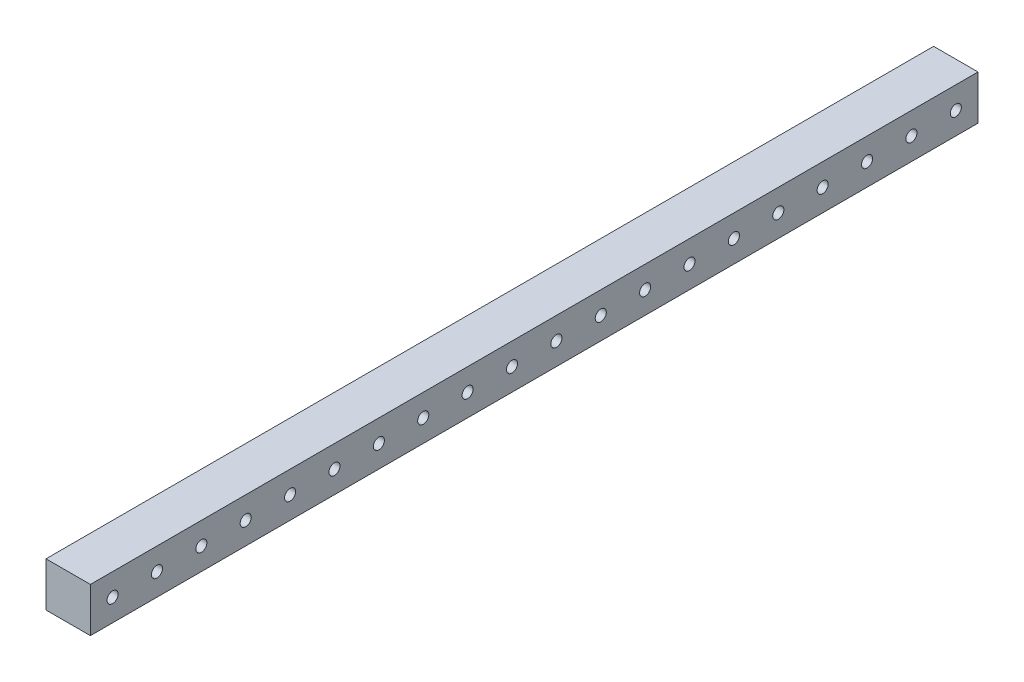
ISO-10303-21;
HEADER;
FILE_DESCRIPTION(('STEP AP214'),'2;1');
FILE_NAME('part.step','',(''),(''),'','','');
FILE_SCHEMA(('AUTOMOTIVE_DESIGN { 1 0 10303 214 1 1 1 1 }'));
ENDSEC;
DATA;
#1=APPLICATION_CONTEXT('core data for automotive mechanical design processes');
#2=APPLICATION_PROTOCOL_DEFINITION('international standard','automotive_design',2000,#1);
#3=PRODUCT_CONTEXT('',#1,'mechanical');
#4=PRODUCT('Part','Part','',(#3));
#5=PRODUCT_RELATED_PRODUCT_CATEGORY('part','',(#4));
#6=PRODUCT_DEFINITION_FORMATION('','',#4);
#7=PRODUCT_DEFINITION_CONTEXT('part definition',#1,'design');
#8=PRODUCT_DEFINITION('design','',#6,#7);
#9=PRODUCT_DEFINITION_SHAPE('','',#8);
#10=(LENGTH_UNIT() NAMED_UNIT(*) SI_UNIT(.MILLI.,.METRE.));
#11=(NAMED_UNIT(*) PLANE_ANGLE_UNIT() SI_UNIT($,.RADIAN.));
#12=(NAMED_UNIT(*) SI_UNIT($,.STERADIAN.) SOLID_ANGLE_UNIT());
#13=UNCERTAINTY_MEASURE_WITH_UNIT(LENGTH_MEASURE(1.E-05),#10,'distance_accuracy_value','');
#14=(GEOMETRIC_REPRESENTATION_CONTEXT(3) GLOBAL_UNCERTAINTY_ASSIGNED_CONTEXT((#13)) GLOBAL_UNIT_ASSIGNED_CONTEXT((#10,
#11,#12)) REPRESENTATION_CONTEXT('',''));
#15=CARTESIAN_POINT('',(0.,0.,0.));
#16=DIRECTION('',(0.,0.,1.));
#17=DIRECTION('',(1.,0.,0.));
#18=AXIS2_PLACEMENT_3D('',#15,#16,#17);
#19=CARTESIAN_POINT('',(10.,0.,390.));
#20=DIRECTION('',(1.,0.,0.));
#21=DIRECTION('',(0.,0.,-1.));
#22=AXIS2_PLACEMENT_3D('',#19,#20,#21);
#23=CYLINDRICAL_SURFACE('',#22,2.5);
#24=CARTESIAN_POINT('',(-10.,0.,390.));
#25=DIRECTION('',(1.,0.,0.));
#26=DIRECTION('',(0.,0.,-1.));
#27=AXIS2_PLACEMENT_3D('',#24,#25,#26);
#28=CIRCLE('',#27,2.5);
#29=CARTESIAN_POINT('',(-10.,0.,387.5));
#30=VERTEX_POINT('',#29);
#31=EDGE_CURVE('E40',#30,#30,#28,.T.);
#32=ORIENTED_EDGE('',*,*,#31,.F.);
#33=EDGE_LOOP('',(#32));
#34=FACE_BOUND('',#33,.T.);
#35=CARTESIAN_POINT('',(10.,0.,390.));
#36=DIRECTION('',(1.,0.,0.));
#37=DIRECTION('',(0.,0.,-1.));
#38=AXIS2_PLACEMENT_3D('',#35,#36,#37);
#39=CIRCLE('',#38,2.5);
#40=CARTESIAN_POINT('',(10.,0.,387.5));
#41=VERTEX_POINT('',#40);
#42=EDGE_CURVE('E11',#41,#41,#39,.T.);
#43=ORIENTED_EDGE('',*,*,#42,.T.);
#44=EDGE_LOOP('',(#43));
#45=FACE_BOUND('',#44,.T.);
#46=ADVANCED_FACE('F32',(#34,#45),#23,.F.);
#47=CARTESIAN_POINT('',(10.,0.,370.));
#48=DIRECTION('',(1.,0.,0.));
#49=DIRECTION('',(0.,0.,-1.));
#50=AXIS2_PLACEMENT_3D('',#47,#48,#49);
#51=CYLINDRICAL_SURFACE('',#50,2.5);
#52=CARTESIAN_POINT('',(-10.,0.,370.));
#53=DIRECTION('',(1.,0.,0.));
#54=DIRECTION('',(0.,0.,-1.));
#55=AXIS2_PLACEMENT_3D('',#52,#53,#54);
#56=CIRCLE('',#55,2.5);
#57=CARTESIAN_POINT('',(-10.,0.,367.5));
#58=VERTEX_POINT('',#57);
#59=EDGE_CURVE('E206',#58,#58,#56,.T.);
#60=ORIENTED_EDGE('',*,*,#59,.F.);
#61=EDGE_LOOP('',(#60));
#62=FACE_BOUND('',#61,.T.);
#63=CARTESIAN_POINT('',(10.,0.,370.));
#64=DIRECTION('',(1.,0.,0.));
#65=DIRECTION('',(0.,0.,-1.));
#66=AXIS2_PLACEMENT_3D('',#63,#64,#65);
#67=CIRCLE('',#66,2.5);
#68=CARTESIAN_POINT('',(10.,0.,367.5));
#69=VERTEX_POINT('',#68);
#70=EDGE_CURVE('E209',#69,#69,#67,.T.);
#71=ORIENTED_EDGE('',*,*,#70,.T.);
#72=EDGE_LOOP('',(#71));
#73=FACE_BOUND('',#72,.T.);
#74=ADVANCED_FACE('F218',(#62,#73),#51,.F.);
#75=CARTESIAN_POINT('',(10.,0.,350.));
#76=DIRECTION('',(1.,0.,0.));
#77=DIRECTION('',(0.,0.,-1.));
#78=AXIS2_PLACEMENT_3D('',#75,#76,#77);
#79=CYLINDRICAL_SURFACE('',#78,2.5);
#80=CARTESIAN_POINT('',(-10.,0.,350.));
#81=DIRECTION('',(1.,0.,0.));
#82=DIRECTION('',(0.,0.,-1.));
#83=AXIS2_PLACEMENT_3D('',#80,#81,#82);
#84=CIRCLE('',#83,2.5);
#85=CARTESIAN_POINT('',(-10.,0.,347.5));
#86=VERTEX_POINT('',#85);
#87=EDGE_CURVE('E200',#86,#86,#84,.T.);
#88=ORIENTED_EDGE('',*,*,#87,.F.);
#89=EDGE_LOOP('',(#88));
#90=FACE_BOUND('',#89,.T.);
#91=CARTESIAN_POINT('',(10.,0.,350.));
#92=DIRECTION('',(1.,0.,0.));
#93=DIRECTION('',(0.,0.,-1.));
#94=AXIS2_PLACEMENT_3D('',#91,#92,#93);
#95=CIRCLE('',#94,2.5);
#96=CARTESIAN_POINT('',(10.,0.,347.5));
#97=VERTEX_POINT('',#96);
#98=EDGE_CURVE('E203',#97,#97,#95,.T.);
#99=ORIENTED_EDGE('',*,*,#98,.T.);
#100=EDGE_LOOP('',(#99));
#101=FACE_BOUND('',#100,.T.);
#102=ADVANCED_FACE('F297',(#90,#101),#79,.F.);
#103=CARTESIAN_POINT('',(10.,0.,330.));
#104=DIRECTION('',(1.,0.,0.));
#105=DIRECTION('',(0.,0.,-1.));
#106=AXIS2_PLACEMENT_3D('',#103,#104,#105);
#107=CYLINDRICAL_SURFACE('',#106,2.5);
#108=CARTESIAN_POINT('',(-10.,0.,330.));
#109=DIRECTION('',(1.,0.,0.));
#110=DIRECTION('',(0.,0.,-1.));
#111=AXIS2_PLACEMENT_3D('',#108,#109,#110);
#112=CIRCLE('',#111,2.5);
#113=CARTESIAN_POINT('',(-10.,0.,327.5));
#114=VERTEX_POINT('',#113);
#115=EDGE_CURVE('E194',#114,#114,#112,.T.);
#116=ORIENTED_EDGE('',*,*,#115,.F.);
#117=EDGE_LOOP('',(#116));
#118=FACE_BOUND('',#117,.T.);
#119=CARTESIAN_POINT('',(10.,0.,330.));
#120=DIRECTION('',(1.,0.,0.));
#121=DIRECTION('',(0.,0.,-1.));
#122=AXIS2_PLACEMENT_3D('',#119,#120,#121);
#123=CIRCLE('',#122,2.5);
#124=CARTESIAN_POINT('',(10.,0.,327.5));
#125=VERTEX_POINT('',#124);
#126=EDGE_CURVE('E197',#125,#125,#123,.T.);
#127=ORIENTED_EDGE('',*,*,#126,.T.);
#128=EDGE_LOOP('',(#127));
#129=FACE_BOUND('',#128,.T.);
#130=ADVANCED_FACE('F293',(#118,#129),#107,.F.);
#131=CARTESIAN_POINT('',(10.,0.,310.));
#132=DIRECTION('',(1.,0.,0.));
#133=DIRECTION('',(0.,0.,-1.));
#134=AXIS2_PLACEMENT_3D('',#131,#132,#133);
#135=CYLINDRICAL_SURFACE('',#134,2.5);
#136=CARTESIAN_POINT('',(-10.,0.,310.));
#137=DIRECTION('',(1.,0.,0.));
#138=DIRECTION('',(0.,0.,-1.));
#139=AXIS2_PLACEMENT_3D('',#136,#137,#138);
#140=CIRCLE('',#139,2.5);
#141=CARTESIAN_POINT('',(-10.,0.,307.5));
#142=VERTEX_POINT('',#141);
#143=EDGE_CURVE('E188',#142,#142,#140,.T.);
#144=ORIENTED_EDGE('',*,*,#143,.F.);
#145=EDGE_LOOP('',(#144));
#146=FACE_BOUND('',#145,.T.);
#147=CARTESIAN_POINT('',(10.,0.,310.));
#148=DIRECTION('',(1.,0.,0.));
#149=DIRECTION('',(0.,0.,-1.));
#150=AXIS2_PLACEMENT_3D('',#147,#148,#149);
#151=CIRCLE('',#150,2.5);
#152=CARTESIAN_POINT('',(10.,0.,307.5));
#153=VERTEX_POINT('',#152);
#154=EDGE_CURVE('E191',#153,#153,#151,.T.);
#155=ORIENTED_EDGE('',*,*,#154,.T.);
#156=EDGE_LOOP('',(#155));
#157=FACE_BOUND('',#156,.T.);
#158=ADVANCED_FACE('F289',(#146,#157),#135,.F.);
#159=CARTESIAN_POINT('',(10.,0.,290.));
#160=DIRECTION('',(1.,0.,0.));
#161=DIRECTION('',(0.,0.,-1.));
#162=AXIS2_PLACEMENT_3D('',#159,#160,#161);
#163=CYLINDRICAL_SURFACE('',#162,2.5);
#164=CARTESIAN_POINT('',(-10.,0.,290.));
#165=DIRECTION('',(1.,0.,0.));
#166=DIRECTION('',(0.,0.,-1.));
#167=AXIS2_PLACEMENT_3D('',#164,#165,#166);
#168=CIRCLE('',#167,2.5);
#169=CARTESIAN_POINT('',(-10.,0.,287.5));
#170=VERTEX_POINT('',#169);
#171=EDGE_CURVE('E182',#170,#170,#168,.T.);
#172=ORIENTED_EDGE('',*,*,#171,.F.);
#173=EDGE_LOOP('',(#172));
#174=FACE_BOUND('',#173,.T.);
#175=CARTESIAN_POINT('',(10.,0.,290.));
#176=DIRECTION('',(1.,0.,0.));
#177=DIRECTION('',(0.,0.,-1.));
#178=AXIS2_PLACEMENT_3D('',#175,#176,#177);
#179=CIRCLE('',#178,2.5);
#180=CARTESIAN_POINT('',(10.,0.,287.5));
#181=VERTEX_POINT('',#180);
#182=EDGE_CURVE('E185',#181,#181,#179,.T.);
#183=ORIENTED_EDGE('',*,*,#182,.T.);
#184=EDGE_LOOP('',(#183));
#185=FACE_BOUND('',#184,.T.);
#186=ADVANCED_FACE('F285',(#174,#185),#163,.F.);
#187=CARTESIAN_POINT('',(10.,0.,270.));
#188=DIRECTION('',(1.,0.,0.));
#189=DIRECTION('',(0.,0.,-1.));
#190=AXIS2_PLACEMENT_3D('',#187,#188,#189);
#191=CYLINDRICAL_SURFACE('',#190,2.5);
#192=CARTESIAN_POINT('',(-10.,0.,270.));
#193=DIRECTION('',(1.,0.,0.));
#194=DIRECTION('',(0.,0.,-1.));
#195=AXIS2_PLACEMENT_3D('',#192,#193,#194);
#196=CIRCLE('',#195,2.5);
#197=CARTESIAN_POINT('',(-10.,0.,267.5));
#198=VERTEX_POINT('',#197);
#199=EDGE_CURVE('E176',#198,#198,#196,.T.);
#200=ORIENTED_EDGE('',*,*,#199,.F.);
#201=EDGE_LOOP('',(#200));
#202=FACE_BOUND('',#201,.T.);
#203=CARTESIAN_POINT('',(10.,0.,270.));
#204=DIRECTION('',(1.,0.,0.));
#205=DIRECTION('',(0.,0.,-1.));
#206=AXIS2_PLACEMENT_3D('',#203,#204,#205);
#207=CIRCLE('',#206,2.5);
#208=CARTESIAN_POINT('',(10.,0.,267.5));
#209=VERTEX_POINT('',#208);
#210=EDGE_CURVE('E179',#209,#209,#207,.T.);
#211=ORIENTED_EDGE('',*,*,#210,.T.);
#212=EDGE_LOOP('',(#211));
#213=FACE_BOUND('',#212,.T.);
#214=ADVANCED_FACE('F281',(#202,#213),#191,.F.);
#215=CARTESIAN_POINT('',(10.,0.,250.));
#216=DIRECTION('',(1.,0.,0.));
#217=DIRECTION('',(0.,0.,-1.));
#218=AXIS2_PLACEMENT_3D('',#215,#216,#217);
#219=CYLINDRICAL_SURFACE('',#218,2.5);
#220=CARTESIAN_POINT('',(-10.,0.,250.));
#221=DIRECTION('',(1.,0.,0.));
#222=DIRECTION('',(0.,0.,-1.));
#223=AXIS2_PLACEMENT_3D('',#220,#221,#222);
#224=CIRCLE('',#223,2.5);
#225=CARTESIAN_POINT('',(-10.,0.,247.5));
#226=VERTEX_POINT('',#225);
#227=EDGE_CURVE('E170',#226,#226,#224,.T.);
#228=ORIENTED_EDGE('',*,*,#227,.F.);
#229=EDGE_LOOP('',(#228));
#230=FACE_BOUND('',#229,.T.);
#231=CARTESIAN_POINT('',(10.,0.,250.));
#232=DIRECTION('',(1.,0.,0.));
#233=DIRECTION('',(0.,0.,-1.));
#234=AXIS2_PLACEMENT_3D('',#231,#232,#233);
#235=CIRCLE('',#234,2.5);
#236=CARTESIAN_POINT('',(10.,0.,247.5));
#237=VERTEX_POINT('',#236);
#238=EDGE_CURVE('E173',#237,#237,#235,.T.);
#239=ORIENTED_EDGE('',*,*,#238,.T.);
#240=EDGE_LOOP('',(#239));
#241=FACE_BOUND('',#240,.T.);
#242=ADVANCED_FACE('F277',(#230,#241),#219,.F.);
#243=CARTESIAN_POINT('',(10.,0.,230.));
#244=DIRECTION('',(1.,0.,0.));
#245=DIRECTION('',(0.,0.,-1.));
#246=AXIS2_PLACEMENT_3D('',#243,#244,#245);
#247=CYLINDRICAL_SURFACE('',#246,2.5);
#248=CARTESIAN_POINT('',(-10.,0.,230.));
#249=DIRECTION('',(1.,0.,0.));
#250=DIRECTION('',(0.,0.,-1.));
#251=AXIS2_PLACEMENT_3D('',#248,#249,#250);
#252=CIRCLE('',#251,2.5);
#253=CARTESIAN_POINT('',(-10.,0.,227.5));
#254=VERTEX_POINT('',#253);
#255=EDGE_CURVE('E164',#254,#254,#252,.T.);
#256=ORIENTED_EDGE('',*,*,#255,.F.);
#257=EDGE_LOOP('',(#256));
#258=FACE_BOUND('',#257,.T.);
#259=CARTESIAN_POINT('',(10.,0.,230.));
#260=DIRECTION('',(1.,0.,0.));
#261=DIRECTION('',(0.,0.,-1.));
#262=AXIS2_PLACEMENT_3D('',#259,#260,#261);
#263=CIRCLE('',#262,2.5);
#264=CARTESIAN_POINT('',(10.,0.,227.5));
#265=VERTEX_POINT('',#264);
#266=EDGE_CURVE('E167',#265,#265,#263,.T.);
#267=ORIENTED_EDGE('',*,*,#266,.T.);
#268=EDGE_LOOP('',(#267));
#269=FACE_BOUND('',#268,.T.);
#270=ADVANCED_FACE('F273',(#258,#269),#247,.F.);
#271=CARTESIAN_POINT('',(10.,0.,210.));
#272=DIRECTION('',(1.,0.,0.));
#273=DIRECTION('',(0.,0.,-1.));
#274=AXIS2_PLACEMENT_3D('',#271,#272,#273);
#275=CYLINDRICAL_SURFACE('',#274,2.5);
#276=CARTESIAN_POINT('',(-10.,0.,210.));
#277=DIRECTION('',(1.,0.,0.));
#278=DIRECTION('',(0.,0.,-1.));
#279=AXIS2_PLACEMENT_3D('',#276,#277,#278);
#280=CIRCLE('',#279,2.5);
#281=CARTESIAN_POINT('',(-10.,0.,207.5));
#282=VERTEX_POINT('',#281);
#283=EDGE_CURVE('E158',#282,#282,#280,.T.);
#284=ORIENTED_EDGE('',*,*,#283,.F.);
#285=EDGE_LOOP('',(#284));
#286=FACE_BOUND('',#285,.T.);
#287=CARTESIAN_POINT('',(10.,0.,210.));
#288=DIRECTION('',(1.,0.,0.));
#289=DIRECTION('',(0.,0.,-1.));
#290=AXIS2_PLACEMENT_3D('',#287,#288,#289);
#291=CIRCLE('',#290,2.5);
#292=CARTESIAN_POINT('',(10.,0.,207.5));
#293=VERTEX_POINT('',#292);
#294=EDGE_CURVE('E161',#293,#293,#291,.T.);
#295=ORIENTED_EDGE('',*,*,#294,.T.);
#296=EDGE_LOOP('',(#295));
#297=FACE_BOUND('',#296,.T.);
#298=ADVANCED_FACE('F269',(#286,#297),#275,.F.);
#299=CARTESIAN_POINT('',(10.,0.,190.));
#300=DIRECTION('',(1.,0.,0.));
#301=DIRECTION('',(0.,0.,-1.));
#302=AXIS2_PLACEMENT_3D('',#299,#300,#301);
#303=CYLINDRICAL_SURFACE('',#302,2.5);
#304=CARTESIAN_POINT('',(-10.,0.,190.));
#305=DIRECTION('',(1.,0.,0.));
#306=DIRECTION('',(0.,0.,-1.));
#307=AXIS2_PLACEMENT_3D('',#304,#305,#306);
#308=CIRCLE('',#307,2.5);
#309=CARTESIAN_POINT('',(-10.,0.,187.5));
#310=VERTEX_POINT('',#309);
#311=EDGE_CURVE('E152',#310,#310,#308,.T.);
#312=ORIENTED_EDGE('',*,*,#311,.F.);
#313=EDGE_LOOP('',(#312));
#314=FACE_BOUND('',#313,.T.);
#315=CARTESIAN_POINT('',(10.,0.,190.));
#316=DIRECTION('',(1.,0.,0.));
#317=DIRECTION('',(0.,0.,-1.));
#318=AXIS2_PLACEMENT_3D('',#315,#316,#317);
#319=CIRCLE('',#318,2.5);
#320=CARTESIAN_POINT('',(10.,0.,187.5));
#321=VERTEX_POINT('',#320);
#322=EDGE_CURVE('E155',#321,#321,#319,.T.);
#323=ORIENTED_EDGE('',*,*,#322,.T.);
#324=EDGE_LOOP('',(#323));
#325=FACE_BOUND('',#324,.T.);
#326=ADVANCED_FACE('F265',(#314,#325),#303,.F.);
#327=CARTESIAN_POINT('',(10.,0.,170.));
#328=DIRECTION('',(1.,0.,0.));
#329=DIRECTION('',(0.,0.,-1.));
#330=AXIS2_PLACEMENT_3D('',#327,#328,#329);
#331=CYLINDRICAL_SURFACE('',#330,2.5);
#332=CARTESIAN_POINT('',(-10.,0.,170.));
#333=DIRECTION('',(1.,0.,0.));
#334=DIRECTION('',(0.,0.,-1.));
#335=AXIS2_PLACEMENT_3D('',#332,#333,#334);
#336=CIRCLE('',#335,2.5);
#337=CARTESIAN_POINT('',(-10.,0.,167.5));
#338=VERTEX_POINT('',#337);
#339=EDGE_CURVE('E146',#338,#338,#336,.T.);
#340=ORIENTED_EDGE('',*,*,#339,.F.);
#341=EDGE_LOOP('',(#340));
#342=FACE_BOUND('',#341,.T.);
#343=CARTESIAN_POINT('',(10.,0.,170.));
#344=DIRECTION('',(1.,0.,0.));
#345=DIRECTION('',(0.,0.,-1.));
#346=AXIS2_PLACEMENT_3D('',#343,#344,#345);
#347=CIRCLE('',#346,2.5);
#348=CARTESIAN_POINT('',(10.,0.,167.5));
#349=VERTEX_POINT('',#348);
#350=EDGE_CURVE('E149',#349,#349,#347,.T.);
#351=ORIENTED_EDGE('',*,*,#350,.T.);
#352=EDGE_LOOP('',(#351));
#353=FACE_BOUND('',#352,.T.);
#354=ADVANCED_FACE('F261',(#342,#353),#331,.F.);
#355=CARTESIAN_POINT('',(10.,0.,150.));
#356=DIRECTION('',(1.,0.,0.));
#357=DIRECTION('',(0.,0.,-1.));
#358=AXIS2_PLACEMENT_3D('',#355,#356,#357);
#359=CYLINDRICAL_SURFACE('',#358,2.5);
#360=CARTESIAN_POINT('',(-10.,0.,150.));
#361=DIRECTION('',(1.,0.,0.));
#362=DIRECTION('',(0.,0.,-1.));
#363=AXIS2_PLACEMENT_3D('',#360,#361,#362);
#364=CIRCLE('',#363,2.5);
#365=CARTESIAN_POINT('',(-10.,0.,147.5));
#366=VERTEX_POINT('',#365);
#367=EDGE_CURVE('E140',#366,#366,#364,.T.);
#368=ORIENTED_EDGE('',*,*,#367,.F.);
#369=EDGE_LOOP('',(#368));
#370=FACE_BOUND('',#369,.T.);
#371=CARTESIAN_POINT('',(10.,0.,150.));
#372=DIRECTION('',(1.,0.,0.));
#373=DIRECTION('',(0.,0.,-1.));
#374=AXIS2_PLACEMENT_3D('',#371,#372,#373);
#375=CIRCLE('',#374,2.5);
#376=CARTESIAN_POINT('',(10.,0.,147.5));
#377=VERTEX_POINT('',#376);
#378=EDGE_CURVE('E143',#377,#377,#375,.T.);
#379=ORIENTED_EDGE('',*,*,#378,.T.);
#380=EDGE_LOOP('',(#379));
#381=FACE_BOUND('',#380,.T.);
#382=ADVANCED_FACE('F257',(#370,#381),#359,.F.);
#383=CARTESIAN_POINT('',(10.,0.,130.));
#384=DIRECTION('',(1.,0.,0.));
#385=DIRECTION('',(0.,0.,-1.));
#386=AXIS2_PLACEMENT_3D('',#383,#384,#385);
#387=CYLINDRICAL_SURFACE('',#386,2.5);
#388=CARTESIAN_POINT('',(-10.,0.,130.));
#389=DIRECTION('',(1.,0.,0.));
#390=DIRECTION('',(0.,0.,-1.));
#391=AXIS2_PLACEMENT_3D('',#388,#389,#390);
#392=CIRCLE('',#391,2.5);
#393=CARTESIAN_POINT('',(-10.,0.,127.5));
#394=VERTEX_POINT('',#393);
#395=EDGE_CURVE('E134',#394,#394,#392,.T.);
#396=ORIENTED_EDGE('',*,*,#395,.F.);
#397=EDGE_LOOP('',(#396));
#398=FACE_BOUND('',#397,.T.);
#399=CARTESIAN_POINT('',(10.,0.,130.));
#400=DIRECTION('',(1.,0.,0.));
#401=DIRECTION('',(0.,0.,-1.));
#402=AXIS2_PLACEMENT_3D('',#399,#400,#401);
#403=CIRCLE('',#402,2.5);
#404=CARTESIAN_POINT('',(10.,0.,127.5));
#405=VERTEX_POINT('',#404);
#406=EDGE_CURVE('E137',#405,#405,#403,.T.);
#407=ORIENTED_EDGE('',*,*,#406,.T.);
#408=EDGE_LOOP('',(#407));
#409=FACE_BOUND('',#408,.T.);
#410=ADVANCED_FACE('F253',(#398,#409),#387,.F.);
#411=CARTESIAN_POINT('',(10.,0.,110.));
#412=DIRECTION('',(1.,0.,0.));
#413=DIRECTION('',(0.,0.,-1.));
#414=AXIS2_PLACEMENT_3D('',#411,#412,#413);
#415=CYLINDRICAL_SURFACE('',#414,2.5);
#416=CARTESIAN_POINT('',(-10.,0.,110.));
#417=DIRECTION('',(1.,0.,0.));
#418=DIRECTION('',(0.,0.,-1.));
#419=AXIS2_PLACEMENT_3D('',#416,#417,#418);
#420=CIRCLE('',#419,2.5);
#421=CARTESIAN_POINT('',(-10.,0.,107.5));
#422=VERTEX_POINT('',#421);
#423=EDGE_CURVE('E128',#422,#422,#420,.T.);
#424=ORIENTED_EDGE('',*,*,#423,.F.);
#425=EDGE_LOOP('',(#424));
#426=FACE_BOUND('',#425,.T.);
#427=CARTESIAN_POINT('',(10.,0.,110.));
#428=DIRECTION('',(1.,0.,0.));
#429=DIRECTION('',(0.,0.,-1.));
#430=AXIS2_PLACEMENT_3D('',#427,#428,#429);
#431=CIRCLE('',#430,2.5);
#432=CARTESIAN_POINT('',(10.,0.,107.5));
#433=VERTEX_POINT('',#432);
#434=EDGE_CURVE('E131',#433,#433,#431,.T.);
#435=ORIENTED_EDGE('',*,*,#434,.T.);
#436=EDGE_LOOP('',(#435));
#437=FACE_BOUND('',#436,.T.);
#438=ADVANCED_FACE('F249',(#426,#437),#415,.F.);
#439=CARTESIAN_POINT('',(10.,0.,90.));
#440=DIRECTION('',(1.,0.,0.));
#441=DIRECTION('',(0.,0.,-1.));
#442=AXIS2_PLACEMENT_3D('',#439,#440,#441);
#443=CYLINDRICAL_SURFACE('',#442,2.5);
#444=CARTESIAN_POINT('',(-10.,0.,90.));
#445=DIRECTION('',(1.,0.,0.));
#446=DIRECTION('',(0.,0.,-1.));
#447=AXIS2_PLACEMENT_3D('',#444,#445,#446);
#448=CIRCLE('',#447,2.5);
#449=CARTESIAN_POINT('',(-10.,0.,87.5));
#450=VERTEX_POINT('',#449);
#451=EDGE_CURVE('E122',#450,#450,#448,.T.);
#452=ORIENTED_EDGE('',*,*,#451,.F.);
#453=EDGE_LOOP('',(#452));
#454=FACE_BOUND('',#453,.T.);
#455=CARTESIAN_POINT('',(10.,0.,90.));
#456=DIRECTION('',(1.,0.,0.));
#457=DIRECTION('',(0.,0.,-1.));
#458=AXIS2_PLACEMENT_3D('',#455,#456,#457);
#459=CIRCLE('',#458,2.5);
#460=CARTESIAN_POINT('',(10.,0.,87.5));
#461=VERTEX_POINT('',#460);
#462=EDGE_CURVE('E125',#461,#461,#459,.T.);
#463=ORIENTED_EDGE('',*,*,#462,.T.);
#464=EDGE_LOOP('',(#463));
#465=FACE_BOUND('',#464,.T.);
#466=ADVANCED_FACE('F245',(#454,#465),#443,.F.);
#467=CARTESIAN_POINT('',(10.,0.,70.));
#468=DIRECTION('',(1.,0.,0.));
#469=DIRECTION('',(0.,0.,-1.));
#470=AXIS2_PLACEMENT_3D('',#467,#468,#469);
#471=CYLINDRICAL_SURFACE('',#470,2.5);
#472=CARTESIAN_POINT('',(-10.,0.,70.));
#473=DIRECTION('',(1.,0.,0.));
#474=DIRECTION('',(0.,0.,-1.));
#475=AXIS2_PLACEMENT_3D('',#472,#473,#474);
#476=CIRCLE('',#475,2.5);
#477=CARTESIAN_POINT('',(-10.,0.,67.5));
#478=VERTEX_POINT('',#477);
#479=EDGE_CURVE('E116',#478,#478,#476,.T.);
#480=ORIENTED_EDGE('',*,*,#479,.F.);
#481=EDGE_LOOP('',(#480));
#482=FACE_BOUND('',#481,.T.);
#483=CARTESIAN_POINT('',(10.,0.,70.));
#484=DIRECTION('',(1.,0.,0.));
#485=DIRECTION('',(0.,0.,-1.));
#486=AXIS2_PLACEMENT_3D('',#483,#484,#485);
#487=CIRCLE('',#486,2.5);
#488=CARTESIAN_POINT('',(10.,0.,67.5));
#489=VERTEX_POINT('',#488);
#490=EDGE_CURVE('E119',#489,#489,#487,.T.);
#491=ORIENTED_EDGE('',*,*,#490,.T.);
#492=EDGE_LOOP('',(#491));
#493=FACE_BOUND('',#492,.T.);
#494=ADVANCED_FACE('F241',(#482,#493),#471,.F.);
#495=CARTESIAN_POINT('',(10.,0.,50.));
#496=DIRECTION('',(1.,0.,0.));
#497=DIRECTION('',(0.,0.,-1.));
#498=AXIS2_PLACEMENT_3D('',#495,#496,#497);
#499=CYLINDRICAL_SURFACE('',#498,2.5);
#500=CARTESIAN_POINT('',(-10.,0.,50.));
#501=DIRECTION('',(1.,0.,0.));
#502=DIRECTION('',(0.,0.,-1.));
#503=AXIS2_PLACEMENT_3D('',#500,#501,#502);
#504=CIRCLE('',#503,2.5);
#505=CARTESIAN_POINT('',(-10.,0.,47.5));
#506=VERTEX_POINT('',#505);
#507=EDGE_CURVE('E110',#506,#506,#504,.T.);
#508=ORIENTED_EDGE('',*,*,#507,.F.);
#509=EDGE_LOOP('',(#508));
#510=FACE_BOUND('',#509,.T.);
#511=CARTESIAN_POINT('',(10.,0.,50.));
#512=DIRECTION('',(1.,0.,0.));
#513=DIRECTION('',(0.,0.,-1.));
#514=AXIS2_PLACEMENT_3D('',#511,#512,#513);
#515=CIRCLE('',#514,2.5);
#516=CARTESIAN_POINT('',(10.,0.,47.5));
#517=VERTEX_POINT('',#516);
#518=EDGE_CURVE('E113',#517,#517,#515,.T.);
#519=ORIENTED_EDGE('',*,*,#518,.T.);
#520=EDGE_LOOP('',(#519));
#521=FACE_BOUND('',#520,.T.);
#522=ADVANCED_FACE('F237',(#510,#521),#499,.F.);
#523=CARTESIAN_POINT('',(-10.,10.0000000000001,400.));
#524=DIRECTION('',(1.,0.,0.));
#525=DIRECTION('',(0.,1.,0.));
#526=AXIS2_PLACEMENT_3D('',#523,#524,#525);
#527=PLANE('',#526);
#528=CARTESIAN_POINT('',(-10.,0.,30.));
#529=DIRECTION('',(1.,0.,0.));
#530=DIRECTION('',(0.,0.,-1.));
#531=AXIS2_PLACEMENT_3D('',#528,#529,#530);
#532=CIRCLE('',#531,2.5);
#533=CARTESIAN_POINT('',(-10.,0.,27.5));
#534=VERTEX_POINT('',#533);
#535=EDGE_CURVE('E476',#534,#534,#532,.T.);
#536=ORIENTED_EDGE('',*,*,#535,.T.);
#537=EDGE_LOOP('',(#536));
#538=FACE_BOUND('',#537,.T.);
#539=CARTESIAN_POINT('',(-10.,0.,10.));
#540=DIRECTION('',(1.,0.,0.));
#541=DIRECTION('',(0.,0.,-1.));
#542=AXIS2_PLACEMENT_3D('',#539,#540,#541);
#543=CIRCLE('',#542,2.5);
#544=CARTESIAN_POINT('',(-10.,0.,7.50000000000001));
#545=VERTEX_POINT('',#544);
#546=EDGE_CURVE('E103',#545,#545,#543,.T.);
#547=ORIENTED_EDGE('',*,*,#546,.T.);
#548=EDGE_LOOP('',(#547));
#549=FACE_BOUND('',#548,.T.);
#550=DIRECTION('',(0.,-1.,0.));
#551=VECTOR('',#550,1.);
#552=CARTESIAN_POINT('',(-10.,10.0000000000001,0.));
#553=LINE('',#552,#551);
#554=CARTESIAN_POINT('',(-10.,10.0000000000001,0.));
#555=VERTEX_POINT('',#554);
#556=CARTESIAN_POINT('',(-10.,-10.0000000000001,0.));
#557=VERTEX_POINT('',#556);
#558=EDGE_CURVE('E100',#555,#557,#553,.T.);
#559=ORIENTED_EDGE('',*,*,#558,.T.);
#560=DIRECTION('',(0.,0.,-1.));
#561=VECTOR('',#560,1.);
#562=CARTESIAN_POINT('',(-10.,-10.0000000000001,400.));
#563=LINE('',#562,#561);
#564=CARTESIAN_POINT('',(-10.,-10.0000000000001,400.));
#565=VERTEX_POINT('',#564);
#566=EDGE_CURVE('E90',#565,#557,#563,.T.);
#567=ORIENTED_EDGE('',*,*,#566,.F.);
#568=DIRECTION('',(0.,-1.,0.));
#569=VECTOR('',#568,1.);
#570=CARTESIAN_POINT('',(-10.,10.0000000000001,400.));
#571=LINE('',#570,#569);
#572=CARTESIAN_POINT('',(-10.,10.0000000000001,400.));
#573=VERTEX_POINT('',#572);
#574=EDGE_CURVE('E84',#573,#565,#571,.T.);
#575=ORIENTED_EDGE('',*,*,#574,.F.);
#576=DIRECTION('',(0.,0.,-1.));
#577=VECTOR('',#576,1.);
#578=CARTESIAN_POINT('',(-10.,10.0000000000001,400.));
#579=LINE('',#578,#577);
#580=EDGE_CURVE('E96',#573,#555,#579,.T.);
#581=ORIENTED_EDGE('',*,*,#580,.T.);
#582=EDGE_LOOP('',(#559,#567,#575,#581));
#583=FACE_BOUND('',#582,.T.);
#584=ORIENTED_EDGE('',*,*,#507,.T.);
#585=EDGE_LOOP('',(#584));
#586=FACE_BOUND('',#585,.T.);
#587=ORIENTED_EDGE('',*,*,#479,.T.);
#588=EDGE_LOOP('',(#587));
#589=FACE_BOUND('',#588,.T.);
#590=ORIENTED_EDGE('',*,*,#451,.T.);
#591=EDGE_LOOP('',(#590));
#592=FACE_BOUND('',#591,.T.);
#593=ORIENTED_EDGE('',*,*,#423,.T.);
#594=EDGE_LOOP('',(#593));
#595=FACE_BOUND('',#594,.T.);
#596=ORIENTED_EDGE('',*,*,#395,.T.);
#597=EDGE_LOOP('',(#596));
#598=FACE_BOUND('',#597,.T.);
#599=ORIENTED_EDGE('',*,*,#367,.T.);
#600=EDGE_LOOP('',(#599));
#601=FACE_BOUND('',#600,.T.);
#602=ORIENTED_EDGE('',*,*,#339,.T.);
#603=EDGE_LOOP('',(#602));
#604=FACE_BOUND('',#603,.T.);
#605=ORIENTED_EDGE('',*,*,#311,.T.);
#606=EDGE_LOOP('',(#605));
#607=FACE_BOUND('',#606,.T.);
#608=ORIENTED_EDGE('',*,*,#283,.T.);
#609=EDGE_LOOP('',(#608));
#610=FACE_BOUND('',#609,.T.);
#611=ORIENTED_EDGE('',*,*,#255,.T.);
#612=EDGE_LOOP('',(#611));
#613=FACE_BOUND('',#612,.T.);
#614=ORIENTED_EDGE('',*,*,#227,.T.);
#615=EDGE_LOOP('',(#614));
#616=FACE_BOUND('',#615,.T.);
#617=ORIENTED_EDGE('',*,*,#199,.T.);
#618=EDGE_LOOP('',(#617));
#619=FACE_BOUND('',#618,.T.);
#620=ORIENTED_EDGE('',*,*,#171,.T.);
#621=EDGE_LOOP('',(#620));
#622=FACE_BOUND('',#621,.T.);
#623=ORIENTED_EDGE('',*,*,#143,.T.);
#624=EDGE_LOOP('',(#623));
#625=FACE_BOUND('',#624,.T.);
#626=ORIENTED_EDGE('',*,*,#115,.T.);
#627=EDGE_LOOP('',(#626));
#628=FACE_BOUND('',#627,.T.);
#629=ORIENTED_EDGE('',*,*,#87,.T.);
#630=EDGE_LOOP('',(#629));
#631=FACE_BOUND('',#630,.T.);
#632=ORIENTED_EDGE('',*,*,#59,.T.);
#633=EDGE_LOOP('',(#632));
#634=FACE_BOUND('',#633,.T.);
#635=ORIENTED_EDGE('',*,*,#31,.T.);
#636=EDGE_LOOP('',(#635));
#637=FACE_BOUND('',#636,.T.);
#638=ADVANCED_FACE('F214',(#538,#549,#583,#586,#589,#592,#595,#598,#601,#604,#607,#610,#613,
#616,#619,#622,#625,#628,#631,#634,#637),#527,.F.);
#639=CARTESIAN_POINT('',(-10.,-10.0000000000001,400.));
#640=DIRECTION('',(0.,1.,0.));
#641=DIRECTION('',(0.,0.,1.));
#642=AXIS2_PLACEMENT_3D('',#639,#640,#641);
#643=PLANE('',#642);
#644=DIRECTION('',(1.,0.,0.));
#645=VECTOR('',#644,1.);
#646=CARTESIAN_POINT('',(-10.,-10.0000000000001,0.));
#647=LINE('',#646,#645);
#648=CARTESIAN_POINT('',(10.,-10.0000000000001,0.));
#649=VERTEX_POINT('',#648);
#650=EDGE_CURVE('E89',#557,#649,#647,.T.);
#651=ORIENTED_EDGE('',*,*,#650,.T.);
#652=DIRECTION('',(0.,0.,-1.));
#653=VECTOR('',#652,1.);
#654=CARTESIAN_POINT('',(10.,-10.0000000000001,400.));
#655=LINE('',#654,#653);
#656=CARTESIAN_POINT('',(10.,-10.0000000000001,400.));
#657=VERTEX_POINT('',#656);
#658=EDGE_CURVE('E87',#657,#649,#655,.T.);
#659=ORIENTED_EDGE('',*,*,#658,.F.);
#660=DIRECTION('',(1.,0.,0.));
#661=VECTOR('',#660,1.);
#662=CARTESIAN_POINT('',(-10.,-10.0000000000001,400.));
#663=LINE('',#662,#661);
#664=EDGE_CURVE('E79',#565,#657,#663,.T.);
#665=ORIENTED_EDGE('',*,*,#664,.F.);
#666=ORIENTED_EDGE('',*,*,#566,.T.);
#667=EDGE_LOOP('',(#651,#659,#665,#666));
#668=FACE_BOUND('',#667,.T.);
#669=ADVANCED_FACE('F88',(#668),#643,.F.);
#670=CARTESIAN_POINT('',(10.,10.0000000000001,400.));
#671=DIRECTION('',(-1.,0.,0.));
#672=DIRECTION('',(0.,-1.,0.));
#673=AXIS2_PLACEMENT_3D('',#670,#671,#672);
#674=PLANE('',#673);
#675=CARTESIAN_POINT('',(10.,0.,30.));
#676=DIRECTION('',(1.,0.,0.));
#677=DIRECTION('',(0.,0.,-1.));
#678=AXIS2_PLACEMENT_3D('',#675,#676,#677);
#679=CIRCLE('',#678,2.5);
#680=CARTESIAN_POINT('',(10.,0.,27.5));
#681=VERTEX_POINT('',#680);
#682=EDGE_CURVE('E478',#681,#681,#679,.T.);
#683=ORIENTED_EDGE('',*,*,#682,.F.);
#684=EDGE_LOOP('',(#683));
#685=FACE_BOUND('',#684,.T.);
#686=CARTESIAN_POINT('',(10.,0.,10.));
#687=DIRECTION('',(1.,0.,0.));
#688=DIRECTION('',(0.,0.,-1.));
#689=AXIS2_PLACEMENT_3D('',#686,#687,#688);
#690=CIRCLE('',#689,2.5);
#691=CARTESIAN_POINT('',(10.,0.,7.5));
#692=VERTEX_POINT('',#691);
#693=EDGE_CURVE('E479',#692,#692,#690,.T.);
#694=ORIENTED_EDGE('',*,*,#693,.F.);
#695=EDGE_LOOP('',(#694));
#696=FACE_BOUND('',#695,.T.);
#697=DIRECTION('',(0.,1.,0.));
#698=VECTOR('',#697,1.);
#699=CARTESIAN_POINT('',(10.,10.0000000000001,0.));
#700=LINE('',#699,#698);
#701=CARTESIAN_POINT('',(10.,10.0000000000001,0.));
#702=VERTEX_POINT('',#701);
#703=EDGE_CURVE('E65',#649,#702,#700,.T.);
#704=ORIENTED_EDGE('',*,*,#703,.T.);
#705=DIRECTION('',(0.,0.,-1.));
#706=VECTOR('',#705,1.);
#707=CARTESIAN_POINT('',(10.,10.0000000000001,400.));
#708=LINE('',#707,#706);
#709=CARTESIAN_POINT('',(10.,10.0000000000001,400.));
#710=VERTEX_POINT('',#709);
#711=EDGE_CURVE('E91',#710,#702,#708,.T.);
#712=ORIENTED_EDGE('',*,*,#711,.F.);
#713=DIRECTION('',(0.,1.,0.));
#714=VECTOR('',#713,1.);
#715=CARTESIAN_POINT('',(10.,10.0000000000001,400.));
#716=LINE('',#715,#714);
#717=EDGE_CURVE('E82',#657,#710,#716,.T.);
#718=ORIENTED_EDGE('',*,*,#717,.F.);
#719=ORIENTED_EDGE('',*,*,#658,.T.);
#720=EDGE_LOOP('',(#704,#712,#718,#719));
#721=FACE_BOUND('',#720,.T.);
#722=ORIENTED_EDGE('',*,*,#518,.F.);
#723=EDGE_LOOP('',(#722));
#724=FACE_BOUND('',#723,.T.);
#725=ORIENTED_EDGE('',*,*,#490,.F.);
#726=EDGE_LOOP('',(#725));
#727=FACE_BOUND('',#726,.T.);
#728=ORIENTED_EDGE('',*,*,#462,.F.);
#729=EDGE_LOOP('',(#728));
#730=FACE_BOUND('',#729,.T.);
#731=ORIENTED_EDGE('',*,*,#434,.F.);
#732=EDGE_LOOP('',(#731));
#733=FACE_BOUND('',#732,.T.);
#734=ORIENTED_EDGE('',*,*,#406,.F.);
#735=EDGE_LOOP('',(#734));
#736=FACE_BOUND('',#735,.T.);
#737=ORIENTED_EDGE('',*,*,#378,.F.);
#738=EDGE_LOOP('',(#737));
#739=FACE_BOUND('',#738,.T.);
#740=ORIENTED_EDGE('',*,*,#350,.F.);
#741=EDGE_LOOP('',(#740));
#742=FACE_BOUND('',#741,.T.);
#743=ORIENTED_EDGE('',*,*,#322,.F.);
#744=EDGE_LOOP('',(#743));
#745=FACE_BOUND('',#744,.T.);
#746=ORIENTED_EDGE('',*,*,#294,.F.);
#747=EDGE_LOOP('',(#746));
#748=FACE_BOUND('',#747,.T.);
#749=ORIENTED_EDGE('',*,*,#266,.F.);
#750=EDGE_LOOP('',(#749));
#751=FACE_BOUND('',#750,.T.);
#752=ORIENTED_EDGE('',*,*,#238,.F.);
#753=EDGE_LOOP('',(#752));
#754=FACE_BOUND('',#753,.T.);
#755=ORIENTED_EDGE('',*,*,#210,.F.);
#756=EDGE_LOOP('',(#755));
#757=FACE_BOUND('',#756,.T.);
#758=ORIENTED_EDGE('',*,*,#182,.F.);
#759=EDGE_LOOP('',(#758));
#760=FACE_BOUND('',#759,.T.);
#761=ORIENTED_EDGE('',*,*,#154,.F.);
#762=EDGE_LOOP('',(#761));
#763=FACE_BOUND('',#762,.T.);
#764=ORIENTED_EDGE('',*,*,#126,.F.);
#765=EDGE_LOOP('',(#764));
#766=FACE_BOUND('',#765,.T.);
#767=ORIENTED_EDGE('',*,*,#98,.F.);
#768=EDGE_LOOP('',(#767));
#769=FACE_BOUND('',#768,.T.);
#770=ORIENTED_EDGE('',*,*,#70,.F.);
#771=EDGE_LOOP('',(#770));
#772=FACE_BOUND('',#771,.T.);
#773=ORIENTED_EDGE('',*,*,#42,.F.);
#774=EDGE_LOOP('',(#773));
#775=FACE_BOUND('',#774,.T.);
#776=ADVANCED_FACE('F93',(#685,#696,#721,#724,#727,#730,#733,#736,#739,#742,#745,#748,#751,#754,
#757,#760,#763,#766,#769,#772,#775),#674,.F.);
#777=CARTESIAN_POINT('',(-10.,10.0000000000001,400.));
#778=DIRECTION('',(0.,-1.,0.));
#779=DIRECTION('',(0.,0.,-1.));
#780=AXIS2_PLACEMENT_3D('',#777,#778,#779);
#781=PLANE('',#780);
#782=DIRECTION('',(-1.,0.,0.));
#783=VECTOR('',#782,1.);
#784=CARTESIAN_POINT('',(-10.,10.0000000000001,0.));
#785=LINE('',#784,#783);
#786=EDGE_CURVE('E71',#702,#555,#785,.T.);
#787=ORIENTED_EDGE('',*,*,#786,.T.);
#788=ORIENTED_EDGE('',*,*,#580,.F.);
#789=DIRECTION('',(-1.,0.,0.));
#790=VECTOR('',#789,1.);
#791=CARTESIAN_POINT('',(-10.,10.0000000000001,400.));
#792=LINE('',#791,#790);
#793=EDGE_CURVE('E48',#710,#573,#792,.T.);
#794=ORIENTED_EDGE('',*,*,#793,.F.);
#795=ORIENTED_EDGE('',*,*,#711,.T.);
#796=EDGE_LOOP('',(#787,#788,#794,#795));
#797=FACE_BOUND('',#796,.T.);
#798=ADVANCED_FACE('F222',(#797),#781,.F.);
#799=CARTESIAN_POINT('',(0.,0.,400.));
#800=DIRECTION('',(0.,0.,1.));
#801=DIRECTION('',(1.,0.,0.));
#802=AXIS2_PLACEMENT_3D('',#799,#800,#801);
#803=PLANE('',#802);
#804=ORIENTED_EDGE('',*,*,#574,.T.);
#805=ORIENTED_EDGE('',*,*,#664,.T.);
#806=ORIENTED_EDGE('',*,*,#717,.T.);
#807=ORIENTED_EDGE('',*,*,#793,.T.);
#808=EDGE_LOOP('',(#804,#805,#806,#807));
#809=FACE_BOUND('',#808,.T.);
#810=ADVANCED_FACE('F80',(#809),#803,.T.);
#811=CARTESIAN_POINT('',(0.,0.,0.));
#812=DIRECTION('',(0.,0.,1.));
#813=DIRECTION('',(1.,0.,0.));
#814=AXIS2_PLACEMENT_3D('',#811,#812,#813);
#815=PLANE('',#814);
#816=ORIENTED_EDGE('',*,*,#558,.F.);
#817=ORIENTED_EDGE('',*,*,#786,.F.);
#818=ORIENTED_EDGE('',*,*,#703,.F.);
#819=ORIENTED_EDGE('',*,*,#650,.F.);
#820=EDGE_LOOP('',(#816,#817,#818,#819));
#821=FACE_BOUND('',#820,.T.);
#822=ADVANCED_FACE('F400',(#821),#815,.F.);
#823=CARTESIAN_POINT('',(10.,0.,10.));
#824=DIRECTION('',(1.,0.,0.));
#825=DIRECTION('',(0.,0.,-1.));
#826=AXIS2_PLACEMENT_3D('',#823,#824,#825);
#827=CYLINDRICAL_SURFACE('',#826,2.5);
#828=ORIENTED_EDGE('',*,*,#546,.F.);
#829=EDGE_LOOP('',(#828));
#830=FACE_BOUND('',#829,.T.);
#831=ORIENTED_EDGE('',*,*,#693,.T.);
#832=EDGE_LOOP('',(#831));
#833=FACE_BOUND('',#832,.T.);
#834=ADVANCED_FACE('F409',(#830,#833),#827,.F.);
#835=CARTESIAN_POINT('',(10.,0.,30.));
#836=DIRECTION('',(1.,0.,0.));
#837=DIRECTION('',(0.,0.,-1.));
#838=AXIS2_PLACEMENT_3D('',#835,#836,#837);
#839=CYLINDRICAL_SURFACE('',#838,2.5);
#840=ORIENTED_EDGE('',*,*,#535,.F.);
#841=EDGE_LOOP('',(#840));
#842=FACE_BOUND('',#841,.T.);
#843=ORIENTED_EDGE('',*,*,#682,.T.);
#844=EDGE_LOOP('',(#843));
#845=FACE_BOUND('',#844,.T.);
#846=ADVANCED_FACE('F417',(#842,#845),#839,.F.);
#847=CLOSED_SHELL('',(#46,#74,#102,#130,#158,#186,#214,#242,#270,#298,#326,#354,#382,#410,#438,
#466,#494,#522,#638,#669,#776,#798,#810,#822,#834,#846));
#848=MANIFOLD_SOLID_BREP('B2',#847);
#849=ADVANCED_BREP_SHAPE_REPRESENTATION('',(#18,#848),#14);
#850=SHAPE_DEFINITION_REPRESENTATION(#9,#849);
ENDSEC;
END-ISO-10303-21;
